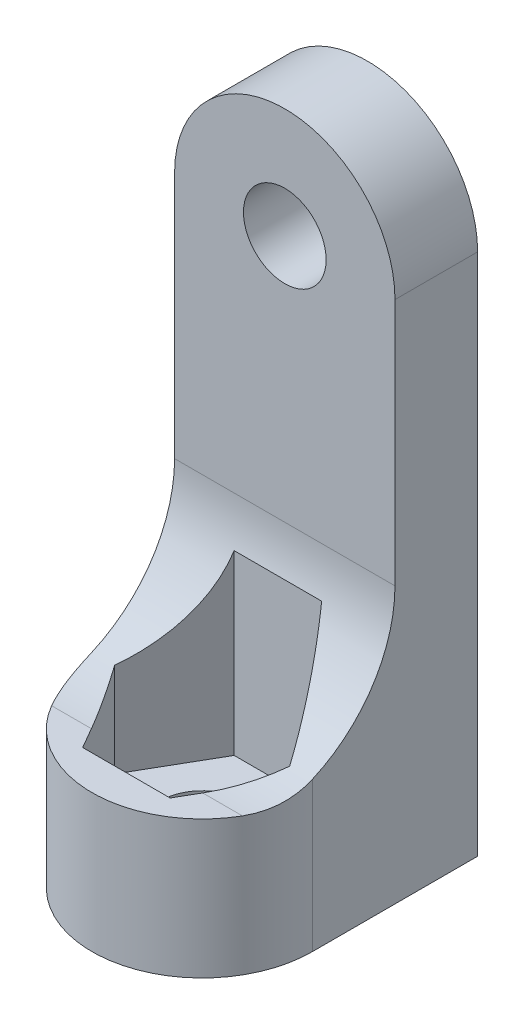
ISO-10303-21;
HEADER;
FILE_DESCRIPTION(('STEP AP214'),'2;1');
FILE_NAME('part.step','',(''),(''),'','','');
FILE_SCHEMA(('AUTOMOTIVE_DESIGN { 1 0 10303 214 1 1 1 1 }'));
ENDSEC;
DATA;
#1=APPLICATION_CONTEXT('core data for automotive mechanical design processes');
#2=APPLICATION_PROTOCOL_DEFINITION('international standard','automotive_design',2000,#1);
#3=PRODUCT_CONTEXT('',#1,'mechanical');
#4=PRODUCT('Part','Part','',(#3));
#5=PRODUCT_RELATED_PRODUCT_CATEGORY('part','',(#4));
#6=PRODUCT_DEFINITION_FORMATION('','',#4);
#7=PRODUCT_DEFINITION_CONTEXT('part definition',#1,'design');
#8=PRODUCT_DEFINITION('design','',#6,#7);
#9=PRODUCT_DEFINITION_SHAPE('','',#8);
#10=(LENGTH_UNIT() NAMED_UNIT(*) SI_UNIT(.MILLI.,.METRE.));
#11=(NAMED_UNIT(*) PLANE_ANGLE_UNIT() SI_UNIT($,.RADIAN.));
#12=(NAMED_UNIT(*) SI_UNIT($,.STERADIAN.) SOLID_ANGLE_UNIT());
#13=UNCERTAINTY_MEASURE_WITH_UNIT(LENGTH_MEASURE(1.E-05),#10,'distance_accuracy_value','');
#14=(GEOMETRIC_REPRESENTATION_CONTEXT(3) GLOBAL_UNCERTAINTY_ASSIGNED_CONTEXT((#13)) GLOBAL_UNIT_ASSIGNED_CONTEXT((#10,
#11,#12)) REPRESENTATION_CONTEXT('',''));
#15=CARTESIAN_POINT('',(0.,0.,0.));
#16=DIRECTION('',(0.,0.,1.));
#17=DIRECTION('',(1.,0.,0.));
#18=AXIS2_PLACEMENT_3D('',#15,#16,#17);
#19=CARTESIAN_POINT('',(0.,23.,0.));
#20=DIRECTION('',(0.,-1.,0.));
#21=DIRECTION('',(0.,0.,-1.));
#22=AXIS2_PLACEMENT_3D('',#19,#20,#21);
#23=CYLINDRICAL_SURFACE('',#22,4.00000000000001);
#24=CARTESIAN_POINT('',(-4.00000000000001,5.41742430504416,0.));
#25=CARTESIAN_POINT('',(-4.00001658678852,5.37998255397397,0.0857415164908386));
#26=CARTESIAN_POINT('',(-3.99724351123325,5.34497420311785,0.172567287945387));
#27=CARTESIAN_POINT('',(-3.98581951908655,5.27997176704503,0.347725554051081));
#28=CARTESIAN_POINT('',(-3.9771667147798,5.24997929605555,0.436058523713548));
#29=CARTESIAN_POINT('',(-3.95400750130823,5.19593443996617,0.611071441837247));
#30=CARTESIAN_POINT('',(-3.93966875154765,5.17174128835248,0.697729974830706));
#31=CARTESIAN_POINT('',(-3.90500309227555,5.12829729858227,0.871066909853963));
#32=CARTESIAN_POINT('',(-3.88467771622588,5.10904519714638,0.957745301122821));
#33=CARTESIAN_POINT('',(-3.83931777223256,5.0763695382406,1.12550202221025));
#34=CARTESIAN_POINT('',(-3.81461682127173,5.06267674081875,1.20661845069577));
#35=CARTESIAN_POINT('',(-3.75988681000159,5.03947956131319,1.36765712516863));
#36=CARTESIAN_POINT('',(-3.72985694292883,5.02997581418466,1.44757918834761));
#37=CARTESIAN_POINT('',(-3.66371654461397,5.01474350594498,1.60775645969359));
#38=CARTESIAN_POINT('',(-3.6274650643695,5.0091225205462,1.68796358432617));
#39=CARTESIAN_POINT('',(-3.54968770125521,5.00174565519387,1.84594051248178));
#40=CARTESIAN_POINT('',(-3.50816306611718,4.99998886269235,1.92371088717785));
#41=CARTESIAN_POINT('',(-3.46410161513777,5.,2.));
#42=B_SPLINE_CURVE_WITH_KNOTS('',3,(#24,#25,#26,#27,#28,#29,#30,#31,#32,#33,#34,#35,#36,#37,#38,
#39,#40,#41),.UNSPECIFIED.,.F.,.F.,(4,2,2,2,2,2,2,2,4),(0.,0.280631835986265,0.561353812774543,
0.834349655808084,1.10727563224841,1.36467762736511,1.62211862477721,1.88643348433434,
2.15068591794609),.UNSPECIFIED.);
#43=CARTESIAN_POINT('',(-4.00000000000001,5.41742430504416,0.));
#44=VERTEX_POINT('',#43);
#45=CARTESIAN_POINT('',(-3.46410161513777,5.,2.));
#46=VERTEX_POINT('',#45);
#47=EDGE_CURVE('E214',#44,#46,#42,.T.);
#48=ORIENTED_EDGE('',*,*,#47,.F.);
#49=DIRECTION('',(0.,-1.,0.));
#50=VECTOR('',#49,1.);
#51=CARTESIAN_POINT('',(-4.00000000000001,23.,0.));
#52=LINE('',#51,#50);
#53=CARTESIAN_POINT('',(-4.00000000000001,0.,0.));
#54=VERTEX_POINT('',#53);
#55=EDGE_CURVE('E271',#44,#54,#52,.T.);
#56=ORIENTED_EDGE('',*,*,#55,.T.);
#57=CARTESIAN_POINT('',(0.,0.,0.));
#58=DIRECTION('',(0.,1.,0.));
#59=DIRECTION('',(0.,0.,1.));
#60=AXIS2_PLACEMENT_3D('',#57,#58,#59);
#61=CIRCLE('',#60,4.00000000000001);
#62=CARTESIAN_POINT('',(4.00000000000001,0.,0.));
#63=VERTEX_POINT('',#62);
#64=EDGE_CURVE('E312',#54,#63,#61,.T.);
#65=ORIENTED_EDGE('',*,*,#64,.T.);
#66=DIRECTION('',(0.,-1.,0.));
#67=VECTOR('',#66,1.);
#68=CARTESIAN_POINT('',(4.00000000000001,23.,0.));
#69=LINE('',#68,#67);
#70=CARTESIAN_POINT('',(4.00000000000002,5.41742430504416,0.));
#71=VERTEX_POINT('',#70);
#72=EDGE_CURVE('E266',#71,#63,#69,.T.);
#73=ORIENTED_EDGE('',*,*,#72,.F.);
#74=CARTESIAN_POINT('',(3.46410161513776,5.,2.00000000000001));
#75=CARTESIAN_POINT('',(3.51089849219286,4.99998551070147,1.91898107053802));
#76=CARTESIAN_POINT('',(3.55483131201429,5.00196872768161,1.83628747965674));
#77=CARTESIAN_POINT('',(3.63673872934544,5.01031624485386,1.66818399499803));
#78=CARTESIAN_POINT('',(3.67471141106054,5.01668195020239,1.58277323839616));
#79=CARTESIAN_POINT('',(3.7434782061119,5.0339397198798,1.41230085859996));
#80=CARTESIAN_POINT('',(3.77444118261519,5.04470233295521,1.32729437095144));
#81=CARTESIAN_POINT('',(3.83035414048236,5.0709762458411,1.15606788537467));
#82=CARTESIAN_POINT('',(3.8553056642317,5.08648632524901,1.06984820474255));
#83=CARTESIAN_POINT('',(3.89792286747964,5.12137945765593,0.901819333246579));
#84=CARTESIAN_POINT('',(3.91592229141792,5.14049196952302,0.820038286525144));
#85=CARTESIAN_POINT('',(3.94661578554651,5.18310868053385,0.656611634452046));
#86=CARTESIAN_POINT('',(3.95930904578376,5.20661354935191,0.574966051671246));
#87=CARTESIAN_POINT('',(3.97979487787445,5.25865890247118,0.410241214143219));
#88=CARTESIAN_POINT('',(3.98744759158129,5.28731705479953,0.327181864151269));
#89=CARTESIAN_POINT('',(3.99755591123102,5.3490741366603,0.162429259689982));
#90=CARTESIAN_POINT('',(4.0000127675339,5.38217199575781,0.0807356812494938));
#91=CARTESIAN_POINT('',(4.00000000000001,5.41742430504416,0.));
#92=B_SPLINE_CURVE_WITH_KNOTS('',3,(#74,#75,#76,#77,#78,#79,#80,#81,#82,#83,#84,#85,#86,#87,#88,
#89,#90,#91),.UNSPECIFIED.,.F.,.F.,(4,2,2,2,2,2,2,2,4),(0.,0.280636709057546,0.561363440542139,
0.834360843129847,1.10728812677397,1.36468810645416,1.62212736231463,1.88643844041972,
2.15068590599849),.UNSPECIFIED.);
#93=CARTESIAN_POINT('',(3.46410161513776,5.,2.00000000000001));
#94=VERTEX_POINT('',#93);
#95=EDGE_CURVE('E205',#94,#71,#92,.T.);
#96=ORIENTED_EDGE('',*,*,#95,.F.);
#97=CARTESIAN_POINT('',(0.,5.,0.));
#98=DIRECTION('',(0.,1.,0.));
#99=DIRECTION('',(0.,0.,1.));
#100=AXIS2_PLACEMENT_3D('',#97,#98,#99);
#101=CIRCLE('',#100,4.00000000000001);
#102=EDGE_CURVE('E269',#46,#94,#101,.T.);
#103=ORIENTED_EDGE('',*,*,#102,.F.);
#104=EDGE_LOOP('',(#48,#56,#65,#73,#96,#103));
#105=FACE_BOUND('',#104,.T.);
#106=ADVANCED_FACE('F34',(#105),#23,.T.);
#107=CARTESIAN_POINT('',(4.,23.,-6.));
#108=DIRECTION('',(-1.,0.,0.));
#109=DIRECTION('',(0.,0.,1.));
#110=AXIS2_PLACEMENT_3D('',#107,#108,#109);
#111=PLANE('',#110);
#112=DIRECTION('',(0.,-1.,0.));
#113=VECTOR('',#112,1.);
#114=CARTESIAN_POINT('',(4.,23.,-6.));
#115=LINE('',#114,#113);
#116=CARTESIAN_POINT('',(4.00000000000002,19.,-6.));
#117=VERTEX_POINT('',#116);
#118=CARTESIAN_POINT('',(4.,0.,-6.));
#119=VERTEX_POINT('',#118);
#120=EDGE_CURVE('E257',#117,#119,#115,.T.);
#121=ORIENTED_EDGE('',*,*,#120,.F.);
#122=DIRECTION('',(0.,0.,-1.));
#123=VECTOR('',#122,1.);
#124=CARTESIAN_POINT('',(4.00000000000002,19.,4.00000000000001));
#125=LINE('',#124,#123);
#126=CARTESIAN_POINT('',(4.00000000000002,19.,-2.99999999999999));
#127=VERTEX_POINT('',#126);
#128=EDGE_CURVE('E189',#127,#117,#125,.T.);
#129=ORIENTED_EDGE('',*,*,#128,.F.);
#130=DIRECTION('',(0.,1.,0.));
#131=VECTOR('',#130,1.);
#132=CARTESIAN_POINT('',(4.00000000000002,23.,-2.99999999999999));
#133=LINE('',#132,#131);
#134=CARTESIAN_POINT('',(4.00000000000002,10.,-2.99999999999999));
#135=VERTEX_POINT('',#134);
#136=EDGE_CURVE('E196',#135,#127,#133,.T.);
#137=ORIENTED_EDGE('',*,*,#136,.F.);
#138=CARTESIAN_POINT('',(4.00000000000002,10.,2.00000000000001));
#139=DIRECTION('',(1.,0.,0.));
#140=DIRECTION('',(0.,0.,1.));
#141=AXIS2_PLACEMENT_3D('',#138,#139,#140);
#142=CIRCLE('',#141,5.);
#143=EDGE_CURVE('E194',#71,#135,#142,.T.);
#144=ORIENTED_EDGE('',*,*,#143,.F.);
#145=ORIENTED_EDGE('',*,*,#72,.T.);
#146=DIRECTION('',(0.,0.,-1.));
#147=VECTOR('',#146,1.);
#148=CARTESIAN_POINT('',(4.,0.,-6.));
#149=LINE('',#148,#147);
#150=EDGE_CURVE('E261',#63,#119,#149,.T.);
#151=ORIENTED_EDGE('',*,*,#150,.T.);
#152=EDGE_LOOP('',(#121,#129,#137,#144,#145,#151));
#153=FACE_BOUND('',#152,.T.);
#154=ADVANCED_FACE('F244',(#153),#111,.F.);
#155=CARTESIAN_POINT('',(-4.00000000000001,23.,0.));
#156=DIRECTION('',(1.,0.,0.));
#157=DIRECTION('',(0.,0.,-1.));
#158=AXIS2_PLACEMENT_3D('',#155,#156,#157);
#159=PLANE('',#158);
#160=DIRECTION('',(0.,1.,0.));
#161=VECTOR('',#160,1.);
#162=CARTESIAN_POINT('',(-4.00000000000001,23.,-3.));
#163=LINE('',#162,#161);
#164=CARTESIAN_POINT('',(-4.00000000000001,10.,-3.));
#165=VERTEX_POINT('',#164);
#166=CARTESIAN_POINT('',(-4.00000000000001,19.,-2.99999999999999));
#167=VERTEX_POINT('',#166);
#168=EDGE_CURVE('E58',#165,#167,#163,.T.);
#169=ORIENTED_EDGE('',*,*,#168,.T.);
#170=DIRECTION('',(0.,0.,-1.));
#171=VECTOR('',#170,1.);
#172=CARTESIAN_POINT('',(-4.00000000000001,19.,4.00000000000001));
#173=LINE('',#172,#171);
#174=CARTESIAN_POINT('',(-4.00000000000001,19.,-6.));
#175=VERTEX_POINT('',#174);
#176=EDGE_CURVE('E188',#167,#175,#173,.T.);
#177=ORIENTED_EDGE('',*,*,#176,.T.);
#178=DIRECTION('',(0.,-1.,0.));
#179=VECTOR('',#178,1.);
#180=CARTESIAN_POINT('',(-4.,23.,-6.));
#181=LINE('',#180,#179);
#182=CARTESIAN_POINT('',(-4.,0.,-6.));
#183=VERTEX_POINT('',#182);
#184=EDGE_CURVE('E267',#175,#183,#181,.T.);
#185=ORIENTED_EDGE('',*,*,#184,.T.);
#186=DIRECTION('',(0.,0.,1.));
#187=VECTOR('',#186,1.);
#188=CARTESIAN_POINT('',(-4.00000000000001,0.,0.));
#189=LINE('',#188,#187);
#190=EDGE_CURVE('E317',#183,#54,#189,.T.);
#191=ORIENTED_EDGE('',*,*,#190,.T.);
#192=ORIENTED_EDGE('',*,*,#55,.F.);
#193=CARTESIAN_POINT('',(-4.00000000000001,10.,2.));
#194=DIRECTION('',(1.,0.,0.));
#195=DIRECTION('',(0.,0.,1.));
#196=AXIS2_PLACEMENT_3D('',#193,#194,#195);
#197=CIRCLE('',#196,5.);
#198=EDGE_CURVE('E191',#44,#165,#197,.T.);
#199=ORIENTED_EDGE('',*,*,#198,.T.);
#200=EDGE_LOOP('',(#169,#177,#185,#191,#192,#199));
#201=FACE_BOUND('',#200,.T.);
#202=ADVANCED_FACE('F237',(#201),#159,.F.);
#203=CARTESIAN_POINT('',(0.,23.,0.));
#204=DIRECTION('',(0.,-1.,0.));
#205=DIRECTION('',(0.,0.,-1.));
#206=AXIS2_PLACEMENT_3D('',#203,#204,#205);
#207=CYLINDRICAL_SURFACE('',#206,1.5);
#208=CARTESIAN_POINT('',(0.,2.,0.));
#209=DIRECTION('',(0.,-1.,0.));
#210=DIRECTION('',(0.,0.,-1.));
#211=AXIS2_PLACEMENT_3D('',#208,#209,#210);
#212=CIRCLE('',#211,1.5);
#213=CARTESIAN_POINT('',(0.,2.,-1.5));
#214=VERTEX_POINT('',#213);
#215=EDGE_CURVE('E38',#214,#214,#212,.T.);
#216=ORIENTED_EDGE('',*,*,#215,.F.);
#217=EDGE_LOOP('',(#216));
#218=FACE_BOUND('',#217,.T.);
#219=CARTESIAN_POINT('',(0.,0.,0.));
#220=DIRECTION('',(0.,1.,0.));
#221=DIRECTION('',(0.,0.,1.));
#222=AXIS2_PLACEMENT_3D('',#219,#220,#221);
#223=CIRCLE('',#222,1.5);
#224=CARTESIAN_POINT('',(0.,0.,1.5));
#225=VERTEX_POINT('',#224);
#226=EDGE_CURVE('E319',#225,#225,#223,.T.);
#227=ORIENTED_EDGE('',*,*,#226,.F.);
#228=EDGE_LOOP('',(#227));
#229=FACE_BOUND('',#228,.T.);
#230=ADVANCED_FACE('F233',(#218,#229),#207,.F.);
#231=CARTESIAN_POINT('',(0.,0.,0.));
#232=DIRECTION('',(0.,1.,0.));
#233=DIRECTION('',(0.,0.,1.));
#234=AXIS2_PLACEMENT_3D('',#231,#232,#233);
#235=PLANE('',#234);
#236=ORIENTED_EDGE('',*,*,#64,.F.);
#237=ORIENTED_EDGE('',*,*,#190,.F.);
#238=DIRECTION('',(-1.,0.,0.));
#239=VECTOR('',#238,1.);
#240=CARTESIAN_POINT('',(-4.,0.,-6.));
#241=LINE('',#240,#239);
#242=EDGE_CURVE('E315',#119,#183,#241,.T.);
#243=ORIENTED_EDGE('',*,*,#242,.F.);
#244=ORIENTED_EDGE('',*,*,#150,.F.);
#245=EDGE_LOOP('',(#236,#237,#243,#244));
#246=FACE_BOUND('',#245,.T.);
#247=ORIENTED_EDGE('',*,*,#226,.T.);
#248=EDGE_LOOP('',(#247));
#249=FACE_BOUND('',#248,.T.);
#250=ADVANCED_FACE('F236',(#246,#249),#235,.F.);
#251=CARTESIAN_POINT('',(-4.,23.,-6.));
#252=DIRECTION('',(0.,0.,1.));
#253=DIRECTION('',(1.,0.,0.));
#254=AXIS2_PLACEMENT_3D('',#251,#252,#253);
#255=PLANE('',#254);
#256=CARTESIAN_POINT('',(0.,19.,-6.));
#257=DIRECTION('',(0.,0.,-1.));
#258=DIRECTION('',(-1.,0.,0.));
#259=AXIS2_PLACEMENT_3D('',#256,#257,#258);
#260=CIRCLE('',#259,1.5);
#261=CARTESIAN_POINT('',(-1.5,19.,-6.));
#262=VERTEX_POINT('',#261);
#263=EDGE_CURVE('E182',#262,#262,#260,.T.);
#264=ORIENTED_EDGE('',*,*,#263,.F.);
#265=EDGE_LOOP('',(#264));
#266=FACE_BOUND('',#265,.T.);
#267=ORIENTED_EDGE('',*,*,#184,.F.);
#268=CARTESIAN_POINT('',(0.,19.,-6.));
#269=DIRECTION('',(0.,0.,1.));
#270=DIRECTION('',(1.,0.,0.));
#271=AXIS2_PLACEMENT_3D('',#268,#269,#270);
#272=CIRCLE('',#271,4.00000000000002);
#273=EDGE_CURVE('E186',#117,#175,#272,.T.);
#274=ORIENTED_EDGE('',*,*,#273,.F.);
#275=ORIENTED_EDGE('',*,*,#120,.T.);
#276=ORIENTED_EDGE('',*,*,#242,.T.);
#277=EDGE_LOOP('',(#267,#274,#275,#276));
#278=FACE_BOUND('',#277,.T.);
#279=ADVANCED_FACE('F231',(#266,#278),#255,.F.);
#280=CARTESIAN_POINT('',(4.00000000000002,5.,2.00000000000001));
#281=DIRECTION('',(0.,1.,0.));
#282=DIRECTION('',(0.,0.,1.));
#283=AXIS2_PLACEMENT_3D('',#280,#281,#282);
#284=PLANE('',#283);
#285=DIRECTION('',(0.5,0.,-0.866025403784439));
#286=VECTOR('',#285,1.);
#287=CARTESIAN_POINT('',(2.51554445662277,5.,1.14294919243113));
#288=LINE('',#287,#286);
#289=CARTESIAN_POINT('',(1.58771324027147,5.,2.75));
#290=VERTEX_POINT('',#289);
#291=CARTESIAN_POINT('',(2.02072594216369,5.,2.00000000000001));
#292=VERTEX_POINT('',#291);
#293=EDGE_CURVE('E180',#290,#292,#288,.T.);
#294=ORIENTED_EDGE('',*,*,#293,.F.);
#295=DIRECTION('',(1.,0.,0.));
#296=VECTOR('',#295,1.);
#297=CARTESIAN_POINT('',(4.00000000000002,5.,2.75));
#298=LINE('',#297,#296);
#299=CARTESIAN_POINT('',(-1.58771324027147,5.,2.75));
#300=VERTEX_POINT('',#299);
#301=EDGE_CURVE('E12',#300,#290,#298,.T.);
#302=ORIENTED_EDGE('',*,*,#301,.F.);
#303=DIRECTION('',(0.5,0.,0.866025403784439));
#304=VECTOR('',#303,1.);
#305=CARTESIAN_POINT('',(-0.515544456622759,5.,4.60705080756889));
#306=LINE('',#305,#304);
#307=CARTESIAN_POINT('',(-2.02072594216369,5.,2.));
#308=VERTEX_POINT('',#307);
#309=EDGE_CURVE('E172',#308,#300,#306,.T.);
#310=ORIENTED_EDGE('',*,*,#309,.F.);
#311=DIRECTION('',(-1.,0.,0.));
#312=VECTOR('',#311,1.);
#313=CARTESIAN_POINT('',(4.00000000000002,5.,2.00000000000001));
#314=LINE('',#313,#312);
#315=EDGE_CURVE('E199',#308,#46,#314,.T.);
#316=ORIENTED_EDGE('',*,*,#315,.T.);
#317=ORIENTED_EDGE('',*,*,#102,.T.);
#318=EDGE_CURVE('E206',#94,#292,#314,.T.);
#319=ORIENTED_EDGE('',*,*,#318,.T.);
#320=EDGE_LOOP('',(#294,#302,#310,#316,#317,#319));
#321=FACE_BOUND('',#320,.T.);
#322=ADVANCED_FACE('F225',(#321),#284,.T.);
#323=CARTESIAN_POINT('',(4.00000000000002,10.,2.00000000000001));
#324=DIRECTION('',(-1.,0.,0.));
#325=DIRECTION('',(0.,0.,1.));
#326=AXIS2_PLACEMENT_3D('',#323,#324,#325);
#327=CYLINDRICAL_SURFACE('',#326,5.);
#328=CARTESIAN_POINT('',(2.02072594216368,10.,2.00000000000001));
#329=DIRECTION('',(0.866025403784439,0.,0.5));
#330=DIRECTION('',(-0.5,0.,0.866025403784439));
#331=AXIS2_PLACEMENT_3D('',#328,#329,#330);
#332=ELLIPSE('',#331,5.77350269189625,5.);
#333=CARTESIAN_POINT('',(3.17542648054294,5.41742430504416,0.));
#334=VERTEX_POINT('',#333);
#335=EDGE_CURVE('E43',#292,#334,#332,.T.);
#336=ORIENTED_EDGE('',*,*,#335,.F.);
#337=ORIENTED_EDGE('',*,*,#318,.F.);
#338=ORIENTED_EDGE('',*,*,#95,.T.);
#339=ORIENTED_EDGE('',*,*,#143,.T.);
#340=DIRECTION('',(-1.,0.,0.));
#341=VECTOR('',#340,1.);
#342=CARTESIAN_POINT('',(4.00000000000002,10.,-2.99999999999999));
#343=LINE('',#342,#341);
#344=EDGE_CURVE('E203',#135,#165,#343,.T.);
#345=ORIENTED_EDGE('',*,*,#344,.T.);
#346=ORIENTED_EDGE('',*,*,#198,.F.);
#347=ORIENTED_EDGE('',*,*,#47,.T.);
#348=ORIENTED_EDGE('',*,*,#315,.F.);
#349=CARTESIAN_POINT('',(-2.02072594216369,10.,2.));
#350=DIRECTION('',(-0.866025403784439,0.,0.5));
#351=DIRECTION('',(-0.5,0.,-0.866025403784439));
#352=AXIS2_PLACEMENT_3D('',#349,#350,#351);
#353=ELLIPSE('',#352,5.77350269189626,5.);
#354=CARTESIAN_POINT('',(-3.17542648054294,5.41742430504416,0.));
#355=VERTEX_POINT('',#354);
#356=EDGE_CURVE('E278',#355,#308,#353,.T.);
#357=ORIENTED_EDGE('',*,*,#356,.F.);
#358=CARTESIAN_POINT('',(-4.33012701892219,10.,2.));
#359=DIRECTION('',(-0.866025403784439,0.,-0.5));
#360=DIRECTION('',(-0.5,0.,0.866025403784439));
#361=AXIS2_PLACEMENT_3D('',#358,#359,#360);
#362=ELLIPSE('',#361,5.77350269189625,5.);
#363=CARTESIAN_POINT('',(-1.58771324027147,8.43875050040041,-2.75));
#364=VERTEX_POINT('',#363);
#365=EDGE_CURVE('E282',#364,#355,#362,.T.);
#366=ORIENTED_EDGE('',*,*,#365,.F.);
#367=DIRECTION('',(-1.,0.,0.));
#368=VECTOR('',#367,1.);
#369=CARTESIAN_POINT('',(4.00000000000002,8.43875050040043,-2.75));
#370=LINE('',#369,#368);
#371=CARTESIAN_POINT('',(1.58771324027147,8.43875050040043,-2.75));
#372=VERTEX_POINT('',#371);
#373=EDGE_CURVE('E284',#372,#364,#370,.T.);
#374=ORIENTED_EDGE('',*,*,#373,.F.);
#375=CARTESIAN_POINT('',(4.3301270189222,10.,2.00000000000001));
#376=DIRECTION('',(0.866025403784439,0.,-0.5));
#377=DIRECTION('',(-0.5,0.,-0.866025403784439));
#378=AXIS2_PLACEMENT_3D('',#375,#376,#377);
#379=ELLIPSE('',#378,5.77350269189626,5.);
#380=EDGE_CURVE('E286',#334,#372,#379,.T.);
#381=ORIENTED_EDGE('',*,*,#380,.F.);
#382=EDGE_LOOP('',(#336,#337,#338,#339,#345,#346,#347,#348,#357,#366,#374,#381));
#383=FACE_BOUND('',#382,.T.);
#384=ADVANCED_FACE('F219',(#383),#327,.F.);
#385=CARTESIAN_POINT('',(4.00000000000002,23.,-2.99999999999999));
#386=DIRECTION('',(0.,0.,1.));
#387=DIRECTION('',(1.,0.,0.));
#388=AXIS2_PLACEMENT_3D('',#385,#386,#387);
#389=PLANE('',#388);
#390=CARTESIAN_POINT('',(0.,19.,-2.99999999999999));
#391=DIRECTION('',(0.,0.,1.));
#392=DIRECTION('',(1.,0.,0.));
#393=AXIS2_PLACEMENT_3D('',#390,#391,#392);
#394=CIRCLE('',#393,1.5);
#395=CARTESIAN_POINT('',(1.50000000000001,19.,-2.99999999999999));
#396=VERTEX_POINT('',#395);
#397=EDGE_CURVE('E185',#396,#396,#394,.T.);
#398=ORIENTED_EDGE('',*,*,#397,.F.);
#399=EDGE_LOOP('',(#398));
#400=FACE_BOUND('',#399,.T.);
#401=CARTESIAN_POINT('',(0.,19.,-2.99999999999999));
#402=DIRECTION('',(0.,0.,1.));
#403=DIRECTION('',(1.,0.,0.));
#404=AXIS2_PLACEMENT_3D('',#401,#402,#403);
#405=CIRCLE('',#404,4.00000000000002);
#406=EDGE_CURVE('E276',#167,#127,#405,.F.);
#407=ORIENTED_EDGE('',*,*,#406,.F.);
#408=ORIENTED_EDGE('',*,*,#168,.F.);
#409=ORIENTED_EDGE('',*,*,#344,.F.);
#410=ORIENTED_EDGE('',*,*,#136,.T.);
#411=EDGE_LOOP('',(#407,#408,#409,#410));
#412=FACE_BOUND('',#411,.T.);
#413=ADVANCED_FACE('F224',(#400,#412),#389,.T.);
#414=CARTESIAN_POINT('',(0.,19.,4.00000000000001));
#415=DIRECTION('',(0.,0.,-1.));
#416=DIRECTION('',(-1.,0.,0.));
#417=AXIS2_PLACEMENT_3D('',#414,#415,#416);
#418=CYLINDRICAL_SURFACE('',#417,4.00000000000002);
#419=ORIENTED_EDGE('',*,*,#273,.T.);
#420=ORIENTED_EDGE('',*,*,#176,.F.);
#421=ORIENTED_EDGE('',*,*,#406,.T.);
#422=ORIENTED_EDGE('',*,*,#128,.T.);
#423=EDGE_LOOP('',(#419,#420,#421,#422));
#424=FACE_BOUND('',#423,.T.);
#425=ADVANCED_FACE('F328',(#424),#418,.T.);
#426=CARTESIAN_POINT('',(0.,19.,4.00000000000001));
#427=DIRECTION('',(0.,0.,-1.));
#428=DIRECTION('',(-1.,0.,0.));
#429=AXIS2_PLACEMENT_3D('',#426,#427,#428);
#430=CYLINDRICAL_SURFACE('',#429,1.5);
#431=ORIENTED_EDGE('',*,*,#397,.T.);
#432=EDGE_LOOP('',(#431));
#433=FACE_BOUND('',#432,.T.);
#434=ORIENTED_EDGE('',*,*,#263,.T.);
#435=EDGE_LOOP('',(#434));
#436=FACE_BOUND('',#435,.T.);
#437=ADVANCED_FACE('F337',(#433,#436),#430,.F.);
#438=CARTESIAN_POINT('',(3.17542648054294,23.,0.));
#439=DIRECTION('',(0.866025403784439,0.,0.5));
#440=DIRECTION('',(0.5,0.,-0.866025403784439));
#441=AXIS2_PLACEMENT_3D('',#438,#439,#440);
#442=PLANE('',#441);
#443=ORIENTED_EDGE('',*,*,#293,.T.);
#444=ORIENTED_EDGE('',*,*,#335,.T.);
#445=DIRECTION('',(0.,-1.,0.));
#446=VECTOR('',#445,1.);
#447=CARTESIAN_POINT('',(3.17542648054294,23.,0.));
#448=LINE('',#447,#446);
#449=CARTESIAN_POINT('',(3.17542648054294,2.,0.));
#450=VERTEX_POINT('',#449);
#451=EDGE_CURVE('E160',#334,#450,#448,.T.);
#452=ORIENTED_EDGE('',*,*,#451,.T.);
#453=DIRECTION('',(-0.5,0.,0.866025403784439));
#454=VECTOR('',#453,1.);
#455=CARTESIAN_POINT('',(3.17542648054294,2.,0.));
#456=LINE('',#455,#454);
#457=CARTESIAN_POINT('',(1.58771324027147,2.,2.75));
#458=VERTEX_POINT('',#457);
#459=EDGE_CURVE('E153',#450,#458,#456,.T.);
#460=ORIENTED_EDGE('',*,*,#459,.T.);
#461=DIRECTION('',(0.,-1.,0.));
#462=VECTOR('',#461,1.);
#463=CARTESIAN_POINT('',(1.58771324027147,23.,2.75));
#464=LINE('',#463,#462);
#465=EDGE_CURVE('E136',#290,#458,#464,.T.);
#466=ORIENTED_EDGE('',*,*,#465,.F.);
#467=EDGE_LOOP('',(#443,#444,#452,#460,#466));
#468=FACE_BOUND('',#467,.T.);
#469=ADVANCED_FACE('F158',(#468),#442,.F.);
#470=CARTESIAN_POINT('',(1.58771324027147,23.,-2.75));
#471=DIRECTION('',(0.866025403784439,0.,-0.5));
#472=DIRECTION('',(-0.5,0.,-0.866025403784439));
#473=AXIS2_PLACEMENT_3D('',#470,#471,#472);
#474=PLANE('',#473);
#475=ORIENTED_EDGE('',*,*,#380,.T.);
#476=DIRECTION('',(0.,-1.,0.));
#477=VECTOR('',#476,1.);
#478=CARTESIAN_POINT('',(1.58771324027147,23.,-2.75));
#479=LINE('',#478,#477);
#480=CARTESIAN_POINT('',(1.58771324027147,2.,-2.75));
#481=VERTEX_POINT('',#480);
#482=EDGE_CURVE('E173',#372,#481,#479,.T.);
#483=ORIENTED_EDGE('',*,*,#482,.T.);
#484=DIRECTION('',(0.5,0.,0.866025403784438));
#485=VECTOR('',#484,1.);
#486=CARTESIAN_POINT('',(1.58771324027147,2.,-2.75));
#487=LINE('',#486,#485);
#488=EDGE_CURVE('E146',#481,#450,#487,.T.);
#489=ORIENTED_EDGE('',*,*,#488,.T.);
#490=ORIENTED_EDGE('',*,*,#451,.F.);
#491=EDGE_LOOP('',(#475,#483,#489,#490));
#492=FACE_BOUND('',#491,.T.);
#493=ADVANCED_FACE('F292',(#492),#474,.F.);
#494=CARTESIAN_POINT('',(-1.58771324027147,23.,-2.75));
#495=DIRECTION('',(0.,0.,-1.));
#496=DIRECTION('',(-1.,0.,0.));
#497=AXIS2_PLACEMENT_3D('',#494,#495,#496);
#498=PLANE('',#497);
#499=ORIENTED_EDGE('',*,*,#373,.T.);
#500=DIRECTION('',(0.,-1.,0.));
#501=VECTOR('',#500,1.);
#502=CARTESIAN_POINT('',(-1.58771324027147,23.,-2.75));
#503=LINE('',#502,#501);
#504=CARTESIAN_POINT('',(-1.58771324027147,2.,-2.75));
#505=VERTEX_POINT('',#504);
#506=EDGE_CURVE('E175',#364,#505,#503,.T.);
#507=ORIENTED_EDGE('',*,*,#506,.T.);
#508=DIRECTION('',(1.,0.,0.));
#509=VECTOR('',#508,1.);
#510=CARTESIAN_POINT('',(-1.58771324027147,2.,-2.75));
#511=LINE('',#510,#509);
#512=EDGE_CURVE('E167',#505,#481,#511,.T.);
#513=ORIENTED_EDGE('',*,*,#512,.T.);
#514=ORIENTED_EDGE('',*,*,#482,.F.);
#515=EDGE_LOOP('',(#499,#507,#513,#514));
#516=FACE_BOUND('',#515,.T.);
#517=ADVANCED_FACE('F299',(#516),#498,.F.);
#518=CARTESIAN_POINT('',(-3.17542648054294,23.,0.));
#519=DIRECTION('',(-0.866025403784439,0.,-0.5));
#520=DIRECTION('',(-0.5,0.,0.866025403784439));
#521=AXIS2_PLACEMENT_3D('',#518,#519,#520);
#522=PLANE('',#521);
#523=ORIENTED_EDGE('',*,*,#365,.T.);
#524=DIRECTION('',(0.,-1.,0.));
#525=VECTOR('',#524,1.);
#526=CARTESIAN_POINT('',(-3.17542648054294,23.,0.));
#527=LINE('',#526,#525);
#528=CARTESIAN_POINT('',(-3.17542648054294,2.,0.));
#529=VERTEX_POINT('',#528);
#530=EDGE_CURVE('E50',#355,#529,#527,.T.);
#531=ORIENTED_EDGE('',*,*,#530,.T.);
#532=DIRECTION('',(0.5,0.,-0.866025403784439));
#533=VECTOR('',#532,1.);
#534=CARTESIAN_POINT('',(-3.17542648054294,2.,0.));
#535=LINE('',#534,#533);
#536=EDGE_CURVE('E164',#529,#505,#535,.T.);
#537=ORIENTED_EDGE('',*,*,#536,.T.);
#538=ORIENTED_EDGE('',*,*,#506,.F.);
#539=EDGE_LOOP('',(#523,#531,#537,#538));
#540=FACE_BOUND('',#539,.T.);
#541=ADVANCED_FACE('F302',(#540),#522,.F.);
#542=CARTESIAN_POINT('',(-1.58771324027147,23.,2.75));
#543=DIRECTION('',(-0.866025403784439,0.,0.5));
#544=DIRECTION('',(0.5,0.,0.866025403784439));
#545=AXIS2_PLACEMENT_3D('',#542,#543,#544);
#546=PLANE('',#545);
#547=ORIENTED_EDGE('',*,*,#309,.T.);
#548=DIRECTION('',(0.,-1.,0.));
#549=VECTOR('',#548,1.);
#550=CARTESIAN_POINT('',(-1.58771324027147,23.,2.75));
#551=LINE('',#550,#549);
#552=CARTESIAN_POINT('',(-1.58771324027147,2.,2.75));
#553=VERTEX_POINT('',#552);
#554=EDGE_CURVE('E145',#300,#553,#551,.T.);
#555=ORIENTED_EDGE('',*,*,#554,.T.);
#556=DIRECTION('',(-0.5,0.,-0.866025403784439));
#557=VECTOR('',#556,1.);
#558=CARTESIAN_POINT('',(-1.58771324027147,2.,2.75));
#559=LINE('',#558,#557);
#560=EDGE_CURVE('E156',#553,#529,#559,.T.);
#561=ORIENTED_EDGE('',*,*,#560,.T.);
#562=ORIENTED_EDGE('',*,*,#530,.F.);
#563=ORIENTED_EDGE('',*,*,#356,.T.);
#564=EDGE_LOOP('',(#547,#555,#561,#562,#563));
#565=FACE_BOUND('',#564,.T.);
#566=ADVANCED_FACE('F303',(#565),#546,.F.);
#567=CARTESIAN_POINT('',(1.58771324027147,23.,2.75));
#568=DIRECTION('',(0.,0.,1.));
#569=DIRECTION('',(1.,0.,0.));
#570=AXIS2_PLACEMENT_3D('',#567,#568,#569);
#571=PLANE('',#570);
#572=ORIENTED_EDGE('',*,*,#301,.T.);
#573=ORIENTED_EDGE('',*,*,#465,.T.);
#574=DIRECTION('',(-1.,0.,0.));
#575=VECTOR('',#574,1.);
#576=CARTESIAN_POINT('',(1.58771324027147,2.,2.75));
#577=LINE('',#576,#575);
#578=EDGE_CURVE('E140',#458,#553,#577,.T.);
#579=ORIENTED_EDGE('',*,*,#578,.T.);
#580=ORIENTED_EDGE('',*,*,#554,.F.);
#581=EDGE_LOOP('',(#572,#573,#579,#580));
#582=FACE_BOUND('',#581,.T.);
#583=ADVANCED_FACE('F138',(#582),#571,.F.);
#584=CARTESIAN_POINT('',(1.58771324027147,2.,2.75));
#585=DIRECTION('',(0.,-1.,0.));
#586=DIRECTION('',(0.,0.,-1.));
#587=AXIS2_PLACEMENT_3D('',#584,#585,#586);
#588=PLANE('',#587);
#589=ORIENTED_EDGE('',*,*,#215,.T.);
#590=EDGE_LOOP('',(#589));
#591=FACE_BOUND('',#590,.T.);
#592=ORIENTED_EDGE('',*,*,#459,.F.);
#593=ORIENTED_EDGE('',*,*,#488,.F.);
#594=ORIENTED_EDGE('',*,*,#512,.F.);
#595=ORIENTED_EDGE('',*,*,#536,.F.);
#596=ORIENTED_EDGE('',*,*,#560,.F.);
#597=ORIENTED_EDGE('',*,*,#578,.F.);
#598=EDGE_LOOP('',(#592,#593,#594,#595,#596,#597));
#599=FACE_BOUND('',#598,.T.);
#600=ADVANCED_FACE('F151',(#591,#599),#588,.F.);
#601=CLOSED_SHELL('',(#106,#154,#202,#230,#250,#279,#322,#384,#413,#425,#437,#469,#493,#517,
#541,#566,#583,#600));
#602=MANIFOLD_SOLID_BREP('B2',#601);
#603=ADVANCED_BREP_SHAPE_REPRESENTATION('',(#18,#602),#14);
#604=SHAPE_DEFINITION_REPRESENTATION(#9,#603);
ENDSEC;
END-ISO-10303-21;
